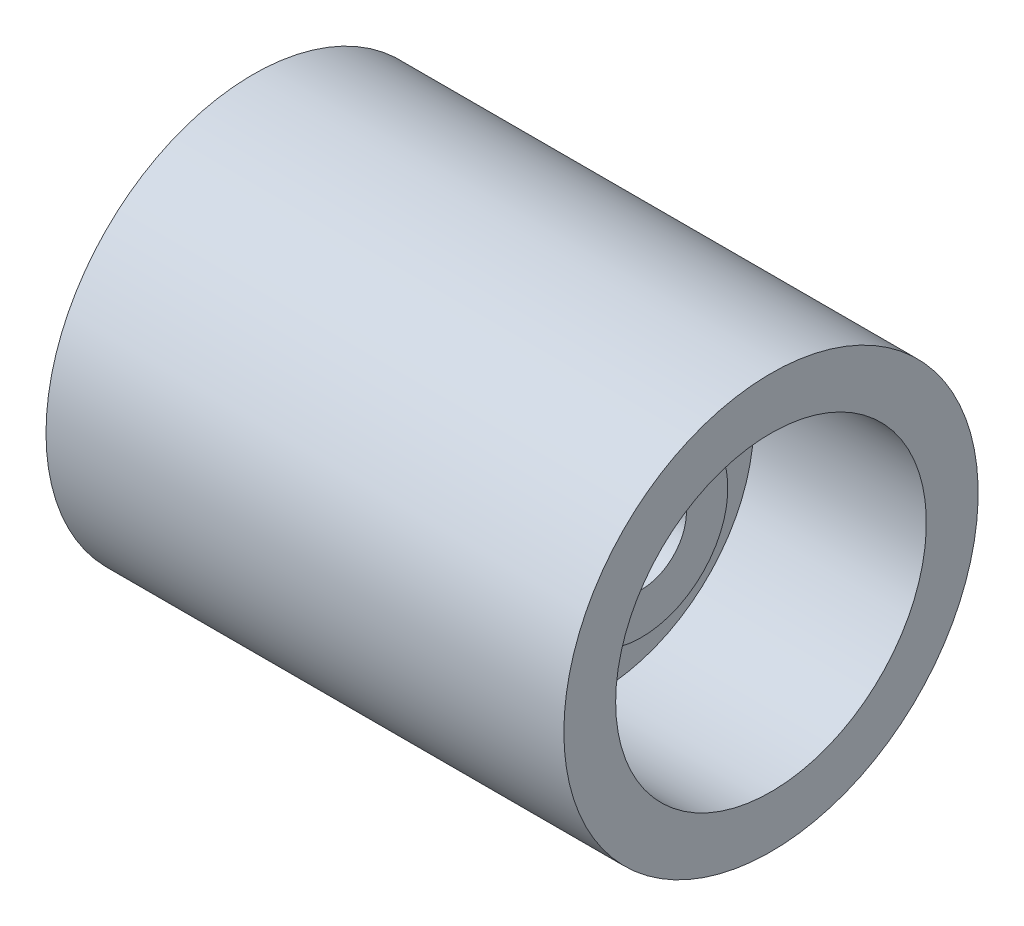
ISO-10303-21;
HEADER;
FILE_DESCRIPTION(('STEP AP214'),'2;1');
FILE_NAME('part.step','',(''),(''),'','','');
FILE_SCHEMA(('AUTOMOTIVE_DESIGN { 1 0 10303 214 1 1 1 1 }'));
ENDSEC;
DATA;
#1=APPLICATION_CONTEXT('core data for automotive mechanical design processes');
#2=APPLICATION_PROTOCOL_DEFINITION('international standard','automotive_design',2000,#1);
#3=PRODUCT_CONTEXT('',#1,'mechanical');
#4=PRODUCT('Part','Part','',(#3));
#5=PRODUCT_RELATED_PRODUCT_CATEGORY('part','',(#4));
#6=PRODUCT_DEFINITION_FORMATION('','',#4);
#7=PRODUCT_DEFINITION_CONTEXT('part definition',#1,'design');
#8=PRODUCT_DEFINITION('design','',#6,#7);
#9=PRODUCT_DEFINITION_SHAPE('','',#8);
#10=(LENGTH_UNIT() NAMED_UNIT(*) SI_UNIT(.MILLI.,.METRE.));
#11=(NAMED_UNIT(*) PLANE_ANGLE_UNIT() SI_UNIT($,.RADIAN.));
#12=(NAMED_UNIT(*) SI_UNIT($,.STERADIAN.) SOLID_ANGLE_UNIT());
#13=UNCERTAINTY_MEASURE_WITH_UNIT(LENGTH_MEASURE(1.E-05),#10,'distance_accuracy_value','');
#14=(GEOMETRIC_REPRESENTATION_CONTEXT(3) GLOBAL_UNCERTAINTY_ASSIGNED_CONTEXT((#13)) GLOBAL_UNIT_ASSIGNED_CONTEXT((#10,
#11,#12)) REPRESENTATION_CONTEXT('',''));
#15=CARTESIAN_POINT('',(0.,0.,0.));
#16=DIRECTION('',(0.,0.,1.));
#17=DIRECTION('',(1.,0.,0.));
#18=AXIS2_PLACEMENT_3D('',#15,#16,#17);
#19=CARTESIAN_POINT('',(-7.5,0.,0.));
#20=DIRECTION('',(1.,0.,0.));
#21=DIRECTION('',(0.,0.,-1.));
#22=AXIS2_PLACEMENT_3D('',#19,#20,#21);
#23=PLANE('',#22);
#24=CARTESIAN_POINT('',(-7.5,0.,0.));
#25=DIRECTION('',(-1.,0.,0.));
#26=DIRECTION('',(0.,0.,1.));
#27=AXIS2_PLACEMENT_3D('',#24,#25,#26);
#28=CIRCLE('',#27,2.6);
#29=CARTESIAN_POINT('',(-7.5,0.,2.6));
#30=VERTEX_POINT('',#29);
#31=EDGE_CURVE('E73',#30,#30,#28,.T.);
#32=ORIENTED_EDGE('',*,*,#31,.F.);
#33=EDGE_LOOP('',(#32));
#34=FACE_BOUND('',#33,.T.);
#35=CARTESIAN_POINT('',(-7.5,0.,0.));
#36=DIRECTION('',(-1.,0.,0.));
#37=DIRECTION('',(0.,0.,1.));
#38=AXIS2_PLACEMENT_3D('',#35,#36,#37);
#39=CIRCLE('',#38,5.);
#40=CARTESIAN_POINT('',(-7.5,0.,5.));
#41=VERTEX_POINT('',#40);
#42=EDGE_CURVE('E10',#41,#41,#39,.T.);
#43=ORIENTED_EDGE('',*,*,#42,.T.);
#44=EDGE_LOOP('',(#43));
#45=FACE_BOUND('',#44,.T.);
#46=ADVANCED_FACE('F36',(#34,#45),#23,.F.);
#47=CARTESIAN_POINT('',(0.,0.,0.));
#48=DIRECTION('',(-1.,0.,0.));
#49=DIRECTION('',(0.,0.,1.));
#50=AXIS2_PLACEMENT_3D('',#47,#48,#49);
#51=CYLINDRICAL_SURFACE('',#50,5.);
#52=ORIENTED_EDGE('',*,*,#42,.F.);
#53=EDGE_LOOP('',(#52));
#54=FACE_BOUND('',#53,.T.);
#55=CARTESIAN_POINT('',(-5.,0.,0.));
#56=DIRECTION('',(-1.,0.,0.));
#57=DIRECTION('',(0.,0.,1.));
#58=AXIS2_PLACEMENT_3D('',#55,#56,#57);
#59=CIRCLE('',#58,5.);
#60=CARTESIAN_POINT('',(-5.,0.,5.));
#61=VERTEX_POINT('',#60);
#62=EDGE_CURVE('E43',#61,#61,#59,.T.);
#63=ORIENTED_EDGE('',*,*,#62,.T.);
#64=EDGE_LOOP('',(#63));
#65=FACE_BOUND('',#64,.T.);
#66=ADVANCED_FACE('F92',(#54,#65),#51,.T.);
#67=CARTESIAN_POINT('',(-5.,5.,0.));
#68=DIRECTION('',(1.,0.,0.));
#69=DIRECTION('',(0.,0.,-1.));
#70=AXIS2_PLACEMENT_3D('',#67,#68,#69);
#71=PLANE('',#70);
#72=ORIENTED_EDGE('',*,*,#62,.F.);
#73=EDGE_LOOP('',(#72));
#74=FACE_BOUND('',#73,.T.);
#75=CARTESIAN_POINT('',(-5.,0.,0.));
#76=DIRECTION('',(-1.,0.,0.));
#77=DIRECTION('',(0.,0.,1.));
#78=AXIS2_PLACEMENT_3D('',#75,#76,#77);
#79=CIRCLE('',#78,9.);
#80=CARTESIAN_POINT('',(-5.,0.,9.));
#81=VERTEX_POINT('',#80);
#82=EDGE_CURVE('E47',#81,#81,#79,.T.);
#83=ORIENTED_EDGE('',*,*,#82,.T.);
#84=EDGE_LOOP('',(#83));
#85=FACE_BOUND('',#84,.T.);
#86=ADVANCED_FACE('F97',(#74,#85),#71,.F.);
#87=CARTESIAN_POINT('',(0.,0.,0.));
#88=DIRECTION('',(-1.,0.,0.));
#89=DIRECTION('',(0.,0.,1.));
#90=AXIS2_PLACEMENT_3D('',#87,#88,#89);
#91=CYLINDRICAL_SURFACE('',#90,9.);
#92=ORIENTED_EDGE('',*,*,#82,.F.);
#93=EDGE_LOOP('',(#92));
#94=FACE_BOUND('',#93,.T.);
#95=CARTESIAN_POINT('',(-15.,0.,0.));
#96=DIRECTION('',(-1.,0.,0.));
#97=DIRECTION('',(0.,0.,1.));
#98=AXIS2_PLACEMENT_3D('',#95,#96,#97);
#99=CIRCLE('',#98,9.);
#100=CARTESIAN_POINT('',(-15.,0.,9.));
#101=VERTEX_POINT('',#100);
#102=EDGE_CURVE('E52',#101,#101,#99,.T.);
#103=ORIENTED_EDGE('',*,*,#102,.T.);
#104=EDGE_LOOP('',(#103));
#105=FACE_BOUND('',#104,.T.);
#106=ADVANCED_FACE('F102',(#94,#105),#91,.F.);
#107=CARTESIAN_POINT('',(-15.,9.,0.));
#108=DIRECTION('',(1.,0.,0.));
#109=DIRECTION('',(0.,0.,-1.));
#110=AXIS2_PLACEMENT_3D('',#107,#108,#109);
#111=PLANE('',#110);
#112=ORIENTED_EDGE('',*,*,#102,.F.);
#113=EDGE_LOOP('',(#112));
#114=FACE_BOUND('',#113,.T.);
#115=CARTESIAN_POINT('',(-15.,0.,0.));
#116=DIRECTION('',(-1.,0.,0.));
#117=DIRECTION('',(0.,0.,1.));
#118=AXIS2_PLACEMENT_3D('',#115,#116,#117);
#119=CIRCLE('',#118,12.);
#120=CARTESIAN_POINT('',(-15.,0.,12.));
#121=VERTEX_POINT('',#120);
#122=EDGE_CURVE('E55',#121,#121,#119,.T.);
#123=ORIENTED_EDGE('',*,*,#122,.T.);
#124=EDGE_LOOP('',(#123));
#125=FACE_BOUND('',#124,.T.);
#126=ADVANCED_FACE('F109',(#114,#125),#111,.F.);
#127=CARTESIAN_POINT('',(0.,0.,0.));
#128=DIRECTION('',(-1.,0.,0.));
#129=DIRECTION('',(0.,0.,1.));
#130=AXIS2_PLACEMENT_3D('',#127,#128,#129);
#131=CYLINDRICAL_SURFACE('',#130,12.);
#132=ORIENTED_EDGE('',*,*,#122,.F.);
#133=EDGE_LOOP('',(#132));
#134=FACE_BOUND('',#133,.T.);
#135=CARTESIAN_POINT('',(15.,0.,0.));
#136=DIRECTION('',(-1.,0.,0.));
#137=DIRECTION('',(0.,0.,1.));
#138=AXIS2_PLACEMENT_3D('',#135,#136,#137);
#139=CIRCLE('',#138,12.);
#140=CARTESIAN_POINT('',(15.,0.,12.));
#141=VERTEX_POINT('',#140);
#142=EDGE_CURVE('E58',#141,#141,#139,.T.);
#143=ORIENTED_EDGE('',*,*,#142,.T.);
#144=EDGE_LOOP('',(#143));
#145=FACE_BOUND('',#144,.T.);
#146=ADVANCED_FACE('F113',(#134,#145),#131,.T.);
#147=CARTESIAN_POINT('',(15.,12.,0.));
#148=DIRECTION('',(-1.,0.,0.));
#149=DIRECTION('',(0.,0.,1.));
#150=AXIS2_PLACEMENT_3D('',#147,#148,#149);
#151=PLANE('',#150);
#152=ORIENTED_EDGE('',*,*,#142,.F.);
#153=EDGE_LOOP('',(#152));
#154=FACE_BOUND('',#153,.T.);
#155=CARTESIAN_POINT('',(15.,0.,0.));
#156=DIRECTION('',(-1.,0.,0.));
#157=DIRECTION('',(0.,0.,1.));
#158=AXIS2_PLACEMENT_3D('',#155,#156,#157);
#159=CIRCLE('',#158,9.);
#160=CARTESIAN_POINT('',(15.,0.,9.));
#161=VERTEX_POINT('',#160);
#162=EDGE_CURVE('E61',#161,#161,#159,.T.);
#163=ORIENTED_EDGE('',*,*,#162,.T.);
#164=EDGE_LOOP('',(#163));
#165=FACE_BOUND('',#164,.T.);
#166=ADVANCED_FACE('F117',(#154,#165),#151,.F.);
#167=CARTESIAN_POINT('',(0.,0.,0.));
#168=DIRECTION('',(-1.,0.,0.));
#169=DIRECTION('',(0.,0.,1.));
#170=AXIS2_PLACEMENT_3D('',#167,#168,#169);
#171=CYLINDRICAL_SURFACE('',#170,9.);
#172=ORIENTED_EDGE('',*,*,#162,.F.);
#173=EDGE_LOOP('',(#172));
#174=FACE_BOUND('',#173,.T.);
#175=CARTESIAN_POINT('',(5.,0.,0.));
#176=DIRECTION('',(-1.,0.,0.));
#177=DIRECTION('',(0.,0.,1.));
#178=AXIS2_PLACEMENT_3D('',#175,#176,#177);
#179=CIRCLE('',#178,9.);
#180=CARTESIAN_POINT('',(5.,0.,9.));
#181=VERTEX_POINT('',#180);
#182=EDGE_CURVE('E64',#181,#181,#179,.T.);
#183=ORIENTED_EDGE('',*,*,#182,.T.);
#184=EDGE_LOOP('',(#183));
#185=FACE_BOUND('',#184,.T.);
#186=ADVANCED_FACE('F121',(#174,#185),#171,.F.);
#187=CARTESIAN_POINT('',(5.,9.,0.));
#188=DIRECTION('',(-1.,0.,0.));
#189=DIRECTION('',(0.,0.,1.));
#190=AXIS2_PLACEMENT_3D('',#187,#188,#189);
#191=PLANE('',#190);
#192=ORIENTED_EDGE('',*,*,#182,.F.);
#193=EDGE_LOOP('',(#192));
#194=FACE_BOUND('',#193,.T.);
#195=CARTESIAN_POINT('',(5.,0.,0.));
#196=DIRECTION('',(-1.,0.,0.));
#197=DIRECTION('',(0.,0.,1.));
#198=AXIS2_PLACEMENT_3D('',#195,#196,#197);
#199=CIRCLE('',#198,5.);
#200=CARTESIAN_POINT('',(5.,0.,5.));
#201=VERTEX_POINT('',#200);
#202=EDGE_CURVE('E67',#201,#201,#199,.T.);
#203=ORIENTED_EDGE('',*,*,#202,.T.);
#204=EDGE_LOOP('',(#203));
#205=FACE_BOUND('',#204,.T.);
#206=ADVANCED_FACE('F125',(#194,#205),#191,.F.);
#207=CARTESIAN_POINT('',(0.,0.,0.));
#208=DIRECTION('',(-1.,0.,0.));
#209=DIRECTION('',(0.,0.,1.));
#210=AXIS2_PLACEMENT_3D('',#207,#208,#209);
#211=CYLINDRICAL_SURFACE('',#210,5.);
#212=ORIENTED_EDGE('',*,*,#202,.F.);
#213=EDGE_LOOP('',(#212));
#214=FACE_BOUND('',#213,.T.);
#215=CARTESIAN_POINT('',(7.5,0.,0.));
#216=DIRECTION('',(-1.,0.,0.));
#217=DIRECTION('',(0.,0.,1.));
#218=AXIS2_PLACEMENT_3D('',#215,#216,#217);
#219=CIRCLE('',#218,5.);
#220=CARTESIAN_POINT('',(7.5,0.,5.));
#221=VERTEX_POINT('',#220);
#222=EDGE_CURVE('E70',#221,#221,#219,.T.);
#223=ORIENTED_EDGE('',*,*,#222,.T.);
#224=EDGE_LOOP('',(#223));
#225=FACE_BOUND('',#224,.T.);
#226=ADVANCED_FACE('F89',(#214,#225),#211,.T.);
#227=CARTESIAN_POINT('',(7.5,5.,0.));
#228=DIRECTION('',(-1.,0.,0.));
#229=DIRECTION('',(0.,0.,1.));
#230=AXIS2_PLACEMENT_3D('',#227,#228,#229);
#231=PLANE('',#230);
#232=CARTESIAN_POINT('',(7.5,0.,0.));
#233=DIRECTION('',(-1.,0.,0.));
#234=DIRECTION('',(0.,0.,1.));
#235=AXIS2_PLACEMENT_3D('',#232,#233,#234);
#236=CIRCLE('',#235,2.6);
#237=CARTESIAN_POINT('',(7.5,0.,2.6));
#238=VERTEX_POINT('',#237);
#239=EDGE_CURVE('E39',#238,#238,#236,.T.);
#240=ORIENTED_EDGE('',*,*,#239,.T.);
#241=EDGE_LOOP('',(#240));
#242=FACE_BOUND('',#241,.T.);
#243=ORIENTED_EDGE('',*,*,#222,.F.);
#244=EDGE_LOOP('',(#243));
#245=FACE_BOUND('',#244,.T.);
#246=ADVANCED_FACE('F80',(#242,#245),#231,.F.);
#247=CARTESIAN_POINT('',(15.,0.,0.));
#248=DIRECTION('',(-1.,0.,0.));
#249=DIRECTION('',(0.,0.,1.));
#250=AXIS2_PLACEMENT_3D('',#247,#248,#249);
#251=CYLINDRICAL_SURFACE('',#250,2.6);
#252=CARTESIAN_POINT('',(-7.5,0.,2.6));
#253=CARTESIAN_POINT('',(-7.34375,0.,2.6));
#254=CARTESIAN_POINT('',(-7.1875,0.,2.6));
#255=CARTESIAN_POINT('',(-6.875,0.,2.6));
#256=CARTESIAN_POINT('',(-6.71875,0.,2.6));
#257=CARTESIAN_POINT('',(-6.40625,0.,2.6));
#258=CARTESIAN_POINT('',(-6.25,0.,2.6));
#259=CARTESIAN_POINT('',(-5.93749999999999,0.,2.6));
#260=CARTESIAN_POINT('',(-5.78124999999999,0.,2.6));
#261=CARTESIAN_POINT('',(-5.46875,0.,2.6));
#262=CARTESIAN_POINT('',(-5.3125,0.,2.6));
#263=CARTESIAN_POINT('',(-5.,0.,2.6));
#264=CARTESIAN_POINT('',(-4.84375,0.,2.6));
#265=CARTESIAN_POINT('',(-4.53125,0.,2.6));
#266=CARTESIAN_POINT('',(-4.375,0.,2.6));
#267=CARTESIAN_POINT('',(-4.0625,0.,2.6));
#268=CARTESIAN_POINT('',(-3.90625,0.,2.6));
#269=CARTESIAN_POINT('',(-3.59375,0.,2.6));
#270=CARTESIAN_POINT('',(-3.4375,0.,2.6));
#271=CARTESIAN_POINT('',(-3.125,0.,2.6));
#272=CARTESIAN_POINT('',(-2.96875,0.,2.6));
#273=CARTESIAN_POINT('',(-2.65625,0.,2.6));
#274=CARTESIAN_POINT('',(-2.5,0.,2.6));
#275=CARTESIAN_POINT('',(-2.1875,0.,2.6));
#276=CARTESIAN_POINT('',(-2.03125,0.,2.6));
#277=CARTESIAN_POINT('',(-1.71875,0.,2.6));
#278=CARTESIAN_POINT('',(-1.5625,0.,2.6));
#279=CARTESIAN_POINT('',(-1.25,0.,2.6));
#280=CARTESIAN_POINT('',(-1.09375,0.,2.6));
#281=CARTESIAN_POINT('',(-0.781249999999998,0.,2.6));
#282=CARTESIAN_POINT('',(-0.624999999999998,0.,2.6));
#283=CARTESIAN_POINT('',(-0.312499999999999,0.,2.6));
#284=CARTESIAN_POINT('',(-0.156249999999998,0.,2.6));
#285=CARTESIAN_POINT('',(0.156250000000002,0.,2.6));
#286=CARTESIAN_POINT('',(0.312500000000002,0.,2.6));
#287=CARTESIAN_POINT('',(0.625000000000002,0.,2.6));
#288=CARTESIAN_POINT('',(0.781250000000002,0.,2.6));
#289=CARTESIAN_POINT('',(1.09375,0.,2.6));
#290=CARTESIAN_POINT('',(1.25,0.,2.6));
#291=CARTESIAN_POINT('',(1.5625,0.,2.6));
#292=CARTESIAN_POINT('',(1.71875,0.,2.6));
#293=CARTESIAN_POINT('',(2.03125,0.,2.6));
#294=CARTESIAN_POINT('',(2.1875,0.,2.6));
#295=CARTESIAN_POINT('',(2.5,0.,2.6));
#296=CARTESIAN_POINT('',(2.65625,0.,2.6));
#297=CARTESIAN_POINT('',(2.96875,0.,2.6));
#298=CARTESIAN_POINT('',(3.125,0.,2.6));
#299=CARTESIAN_POINT('',(3.4375,0.,2.6));
#300=CARTESIAN_POINT('',(3.59375,0.,2.6));
#301=CARTESIAN_POINT('',(3.90625,0.,2.6));
#302=CARTESIAN_POINT('',(4.0625,0.,2.6));
#303=CARTESIAN_POINT('',(4.375,0.,2.6));
#304=CARTESIAN_POINT('',(4.53125,0.,2.6));
#305=CARTESIAN_POINT('',(4.84375,0.,2.6));
#306=CARTESIAN_POINT('',(5.,0.,2.6));
#307=CARTESIAN_POINT('',(5.3125,0.,2.6));
#308=CARTESIAN_POINT('',(5.46875,0.,2.6));
#309=CARTESIAN_POINT('',(5.78125,0.,2.6));
#310=CARTESIAN_POINT('',(5.9375,0.,2.6));
#311=CARTESIAN_POINT('',(6.25,0.,2.6));
#312=CARTESIAN_POINT('',(6.40625,0.,2.6));
#313=CARTESIAN_POINT('',(6.71875,0.,2.6));
#314=CARTESIAN_POINT('',(6.875,0.,2.6));
#315=CARTESIAN_POINT('',(7.1875,0.,2.6));
#316=CARTESIAN_POINT('',(7.34375,0.,2.6));
#317=CARTESIAN_POINT('',(7.5,0.,2.6));
#318=B_SPLINE_CURVE_WITH_KNOTS('',3,(#252,#253,#254,#255,#256,#257,#258,#259,#260,#261,#262,
#263,#264,#265,#266,#267,#268,#269,#270,#271,#272,#273,#274,#275,#276,#277,#278,#279,#280,#281,
#282,#283,#284,#285,#286,#287,#288,#289,#290,#291,#292,#293,#294,#295,#296,#297,#298,#299,#300,
#301,#302,#303,#304,#305,#306,#307,#308,#309,#310,#311,#312,#313,#314,#315,#316,#317),
.UNSPECIFIED.,.F.,.F.,(4,2,2,2,2,2,2,2,2,2,2,2,2,2,2,2,2,2,2,2,2,2,2,2,2,2,2,2,2,2,2,2,4),(0.,
0.46875,0.937500000000001,1.40625,1.875,2.34375,2.8125,3.28125,3.75,4.21875,4.6875,5.15625,
5.625,6.09375,6.5625,7.03125,7.5,7.96875,8.4375,8.90625,9.375,9.84375,10.3125,10.78125,11.25,
11.71875,12.1875,12.65625,13.125,13.59375,14.0625,14.53125,15.),.UNSPECIFIED.);
#319=EDGE_CURVE('BSEAM83',#30,#238,#318,.T.);
#320=ORIENTED_EDGE('',*,*,#31,.T.);
#321=ORIENTED_EDGE('',*,*,#239,.F.);
#322=ORIENTED_EDGE('',*,*,#319,.T.);
#323=ORIENTED_EDGE('',*,*,#319,.F.);
#324=EDGE_LOOP('',(#320,#322,#321,#323));
#325=FACE_BOUND('',#324,.T.);
#326=ADVANCED_FACE('F83',(#325),#251,.F.);
#327=CLOSED_SHELL('',(#46,#66,#86,#106,#126,#146,#166,#186,#206,#226,#246,#326));
#328=MANIFOLD_SOLID_BREP('B2',#327);
#329=ADVANCED_BREP_SHAPE_REPRESENTATION('',(#18,#328),#14);
#330=SHAPE_DEFINITION_REPRESENTATION(#9,#329);
ENDSEC;
END-ISO-10303-21;
